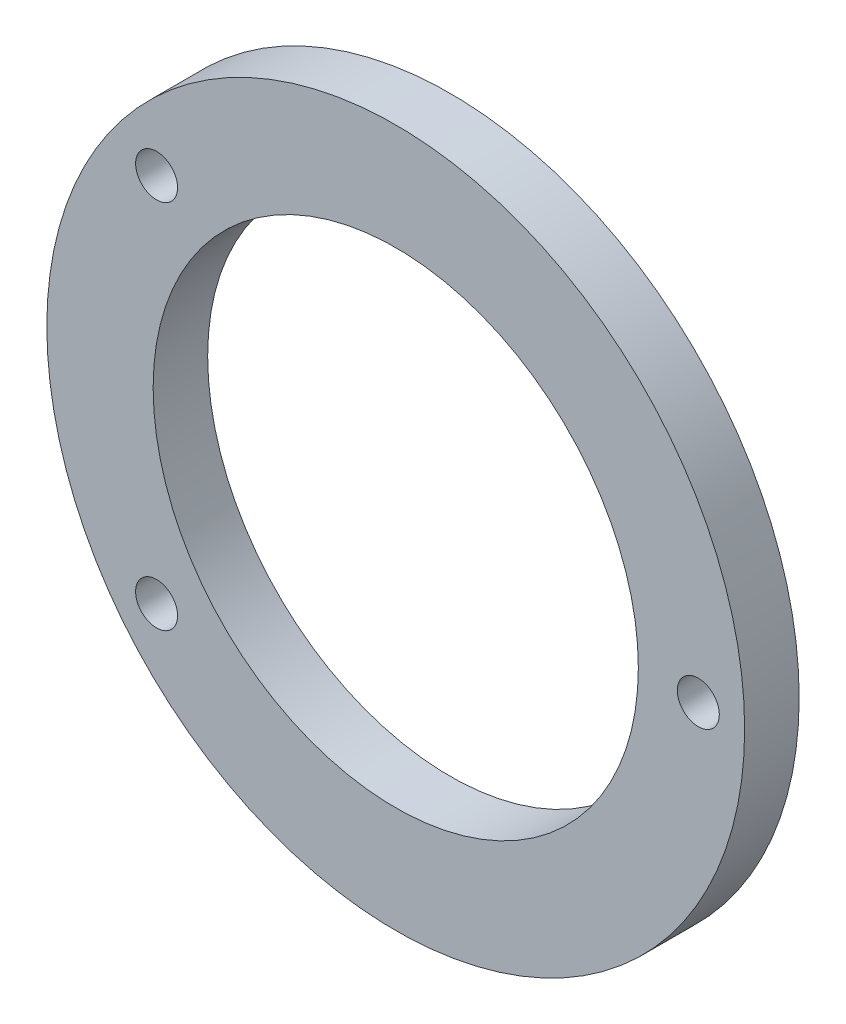
ISO-10303-21;
HEADER;
FILE_DESCRIPTION(('STEP AP214'),'2;1');
FILE_NAME('part.step','',(''),(''),'','','');
FILE_SCHEMA(('AUTOMOTIVE_DESIGN { 1 0 10303 214 1 1 1 1 }'));
ENDSEC;
DATA;
#1=APPLICATION_CONTEXT('core data for automotive mechanical design processes');
#2=APPLICATION_PROTOCOL_DEFINITION('international standard','automotive_design',2000,#1);
#3=PRODUCT_CONTEXT('',#1,'mechanical');
#4=PRODUCT('Part','Part','',(#3));
#5=PRODUCT_RELATED_PRODUCT_CATEGORY('part','',(#4));
#6=PRODUCT_DEFINITION_FORMATION('','',#4);
#7=PRODUCT_DEFINITION_CONTEXT('part definition',#1,'design');
#8=PRODUCT_DEFINITION('design','',#6,#7);
#9=PRODUCT_DEFINITION_SHAPE('','',#8);
#10=(LENGTH_UNIT() NAMED_UNIT(*) SI_UNIT(.MILLI.,.METRE.));
#11=(NAMED_UNIT(*) PLANE_ANGLE_UNIT() SI_UNIT($,.RADIAN.));
#12=(NAMED_UNIT(*) SI_UNIT($,.STERADIAN.) SOLID_ANGLE_UNIT());
#13=UNCERTAINTY_MEASURE_WITH_UNIT(LENGTH_MEASURE(1.E-05),#10,'distance_accuracy_value','');
#14=(GEOMETRIC_REPRESENTATION_CONTEXT(3) GLOBAL_UNCERTAINTY_ASSIGNED_CONTEXT((#13)) GLOBAL_UNIT_ASSIGNED_CONTEXT((#10,
#11,#12)) REPRESENTATION_CONTEXT('',''));
#15=CARTESIAN_POINT('',(0.,0.,0.));
#16=DIRECTION('',(0.,0.,1.));
#17=DIRECTION('',(1.,0.,0.));
#18=AXIS2_PLACEMENT_3D('',#15,#16,#17);
#19=CARTESIAN_POINT('',(0.,-2.22044604925031E-13,5.));
#20=DIRECTION('',(0.,0.,1.));
#21=DIRECTION('',(1.,0.,0.));
#22=AXIS2_PLACEMENT_3D('',#19,#20,#21);
#23=PLANE('',#22);
#24=CARTESIAN_POINT('',(-21.9331370305298,16.9999999999999,5.));
#25=DIRECTION('',(0.,0.,1.));
#26=DIRECTION('',(1.,0.,0.));
#27=AXIS2_PLACEMENT_3D('',#24,#25,#26);
#28=CIRCLE('',#27,1.92500000000001);
#29=CARTESIAN_POINT('',(-20.0081370305298,16.9999999999999,5.));
#30=VERTEX_POINT('',#29);
#31=EDGE_CURVE('E52',#30,#30,#28,.T.);
#32=ORIENTED_EDGE('',*,*,#31,.F.);
#33=EDGE_LOOP('',(#32));
#34=FACE_BOUND('',#33,.T.);
#35=CARTESIAN_POINT('',(0.,-2.22044604925031E-13,5.));
#36=DIRECTION('',(0.,0.,1.));
#37=DIRECTION('',(1.,0.,0.));
#38=AXIS2_PLACEMENT_3D('',#35,#36,#37);
#39=CIRCLE('',#38,22.25);
#40=CARTESIAN_POINT('',(22.2500000000001,-2.22044604925031E-13,5.));
#41=VERTEX_POINT('',#40);
#42=EDGE_CURVE('E41',#41,#41,#39,.T.);
#43=ORIENTED_EDGE('',*,*,#42,.F.);
#44=EDGE_LOOP('',(#43));
#45=FACE_BOUND('',#44,.T.);
#46=CARTESIAN_POINT('',(0.,-2.22044604925031E-13,5.));
#47=DIRECTION('',(0.,0.,1.));
#48=DIRECTION('',(1.,0.,0.));
#49=AXIS2_PLACEMENT_3D('',#46,#47,#48);
#50=CIRCLE('',#49,32.);
#51=CARTESIAN_POINT('',(32.0000000000001,-2.22044604925031E-13,5.));
#52=VERTEX_POINT('',#51);
#53=EDGE_CURVE('E10',#52,#52,#50,.T.);
#54=ORIENTED_EDGE('',*,*,#53,.T.);
#55=EDGE_LOOP('',(#54));
#56=FACE_BOUND('',#55,.T.);
#57=CARTESIAN_POINT('',(27.7500000000001,-2.22044604925031E-13,5.));
#58=DIRECTION('',(0.,0.,1.));
#59=DIRECTION('',(1.,0.,0.));
#60=AXIS2_PLACEMENT_3D('',#57,#58,#59);
#61=CIRCLE('',#60,1.92500000000007);
#62=CARTESIAN_POINT('',(29.6750000000001,-2.22044604925031E-13,5.));
#63=VERTEX_POINT('',#62);
#64=EDGE_CURVE('E46',#63,#63,#61,.T.);
#65=ORIENTED_EDGE('',*,*,#64,.F.);
#66=EDGE_LOOP('',(#65));
#67=FACE_BOUND('',#66,.T.);
#68=CARTESIAN_POINT('',(-21.9331370305298,-17.0000000000001,5.));
#69=DIRECTION('',(0.,0.,1.));
#70=DIRECTION('',(1.,0.,0.));
#71=AXIS2_PLACEMENT_3D('',#68,#69,#70);
#72=CIRCLE('',#71,1.92500000000001);
#73=CARTESIAN_POINT('',(-20.0081370305298,-17.0000000000001,5.));
#74=VERTEX_POINT('',#73);
#75=EDGE_CURVE('E58',#74,#74,#72,.T.);
#76=ORIENTED_EDGE('',*,*,#75,.F.);
#77=EDGE_LOOP('',(#76));
#78=FACE_BOUND('',#77,.T.);
#79=ADVANCED_FACE('F30',(#34,#45,#56,#67,#78),#23,.T.);
#80=CARTESIAN_POINT('',(0.,-2.22044604925031E-13,0.));
#81=DIRECTION('',(0.,0.,1.));
#82=DIRECTION('',(1.,0.,0.));
#83=AXIS2_PLACEMENT_3D('',#80,#81,#82);
#84=PLANE('',#83);
#85=CARTESIAN_POINT('',(0.,-2.22044604925031E-13,0.));
#86=DIRECTION('',(0.,0.,1.));
#87=DIRECTION('',(1.,0.,0.));
#88=AXIS2_PLACEMENT_3D('',#85,#86,#87);
#89=CIRCLE('',#88,32.);
#90=CARTESIAN_POINT('',(32.0000000000001,-2.22044604925031E-13,0.));
#91=VERTEX_POINT('',#90);
#92=EDGE_CURVE('E34',#91,#91,#89,.T.);
#93=ORIENTED_EDGE('',*,*,#92,.F.);
#94=EDGE_LOOP('',(#93));
#95=FACE_BOUND('',#94,.T.);
#96=CARTESIAN_POINT('',(0.,-2.22044604925031E-13,0.));
#97=DIRECTION('',(0.,0.,1.));
#98=DIRECTION('',(1.,0.,0.));
#99=AXIS2_PLACEMENT_3D('',#96,#97,#98);
#100=CIRCLE('',#99,22.25);
#101=CARTESIAN_POINT('',(22.2500000000001,-2.22044604925031E-13,0.));
#102=VERTEX_POINT('',#101);
#103=EDGE_CURVE('E43',#102,#102,#100,.T.);
#104=ORIENTED_EDGE('',*,*,#103,.T.);
#105=EDGE_LOOP('',(#104));
#106=FACE_BOUND('',#105,.T.);
#107=CARTESIAN_POINT('',(27.7500000000001,-2.22044604925031E-13,0.));
#108=DIRECTION('',(0.,0.,1.));
#109=DIRECTION('',(1.,0.,0.));
#110=AXIS2_PLACEMENT_3D('',#107,#108,#109);
#111=CIRCLE('',#110,1.92500000000007);
#112=CARTESIAN_POINT('',(29.6750000000001,-2.22044604925031E-13,0.));
#113=VERTEX_POINT('',#112);
#114=EDGE_CURVE('E49',#113,#113,#111,.T.);
#115=ORIENTED_EDGE('',*,*,#114,.T.);
#116=EDGE_LOOP('',(#115));
#117=FACE_BOUND('',#116,.T.);
#118=CARTESIAN_POINT('',(-21.9331370305298,16.9999999999999,0.));
#119=DIRECTION('',(0.,0.,1.));
#120=DIRECTION('',(1.,0.,0.));
#121=AXIS2_PLACEMENT_3D('',#118,#119,#120);
#122=CIRCLE('',#121,1.92500000000001);
#123=CARTESIAN_POINT('',(-20.0081370305298,16.9999999999999,0.));
#124=VERTEX_POINT('',#123);
#125=EDGE_CURVE('E55',#124,#124,#122,.T.);
#126=ORIENTED_EDGE('',*,*,#125,.T.);
#127=EDGE_LOOP('',(#126));
#128=FACE_BOUND('',#127,.T.);
#129=CARTESIAN_POINT('',(-21.9331370305298,-17.0000000000001,0.));
#130=DIRECTION('',(0.,0.,1.));
#131=DIRECTION('',(1.,0.,0.));
#132=AXIS2_PLACEMENT_3D('',#129,#130,#131);
#133=CIRCLE('',#132,1.92500000000001);
#134=CARTESIAN_POINT('',(-20.0081370305298,-17.0000000000001,0.));
#135=VERTEX_POINT('',#134);
#136=EDGE_CURVE('E61',#135,#135,#133,.T.);
#137=ORIENTED_EDGE('',*,*,#136,.T.);
#138=EDGE_LOOP('',(#137));
#139=FACE_BOUND('',#138,.T.);
#140=ADVANCED_FACE('F71',(#95,#106,#117,#128,#139),#84,.F.);
#141=CARTESIAN_POINT('',(0.,-2.22044604925031E-13,5.));
#142=DIRECTION('',(0.,0.,-1.));
#143=DIRECTION('',(-1.,0.,0.));
#144=AXIS2_PLACEMENT_3D('',#141,#142,#143);
#145=CYLINDRICAL_SURFACE('',#144,32.);
#146=ORIENTED_EDGE('',*,*,#53,.F.);
#147=EDGE_LOOP('',(#146));
#148=FACE_BOUND('',#147,.T.);
#149=ORIENTED_EDGE('',*,*,#92,.T.);
#150=EDGE_LOOP('',(#149));
#151=FACE_BOUND('',#150,.T.);
#152=ADVANCED_FACE('F32',(#148,#151),#145,.T.);
#153=CARTESIAN_POINT('',(0.,-2.22044604925031E-13,5.));
#154=DIRECTION('',(0.,0.,-1.));
#155=DIRECTION('',(-1.,0.,0.));
#156=AXIS2_PLACEMENT_3D('',#153,#154,#155);
#157=CYLINDRICAL_SURFACE('',#156,22.25);
#158=ORIENTED_EDGE('',*,*,#42,.T.);
#159=EDGE_LOOP('',(#158));
#160=FACE_BOUND('',#159,.T.);
#161=ORIENTED_EDGE('',*,*,#103,.F.);
#162=EDGE_LOOP('',(#161));
#163=FACE_BOUND('',#162,.T.);
#164=ADVANCED_FACE('F81',(#160,#163),#157,.F.);
#165=CARTESIAN_POINT('',(27.7500000000001,-2.22044604925031E-13,5.));
#166=DIRECTION('',(0.,0.,-1.));
#167=DIRECTION('',(-1.,0.,0.));
#168=AXIS2_PLACEMENT_3D('',#165,#166,#167);
#169=CYLINDRICAL_SURFACE('',#168,1.92500000000007);
#170=ORIENTED_EDGE('',*,*,#64,.T.);
#171=EDGE_LOOP('',(#170));
#172=FACE_BOUND('',#171,.T.);
#173=ORIENTED_EDGE('',*,*,#114,.F.);
#174=EDGE_LOOP('',(#173));
#175=FACE_BOUND('',#174,.T.);
#176=ADVANCED_FACE('F84',(#172,#175),#169,.F.);
#177=CARTESIAN_POINT('',(-21.9331370305298,16.9999999999999,5.));
#178=DIRECTION('',(0.,0.,-1.));
#179=DIRECTION('',(-1.,0.,0.));
#180=AXIS2_PLACEMENT_3D('',#177,#178,#179);
#181=CYLINDRICAL_SURFACE('',#180,1.92500000000001);
#182=ORIENTED_EDGE('',*,*,#31,.T.);
#183=EDGE_LOOP('',(#182));
#184=FACE_BOUND('',#183,.T.);
#185=ORIENTED_EDGE('',*,*,#125,.F.);
#186=EDGE_LOOP('',(#185));
#187=FACE_BOUND('',#186,.T.);
#188=ADVANCED_FACE('F88',(#184,#187),#181,.F.);
#189=CARTESIAN_POINT('',(-21.9331370305298,-17.0000000000001,5.));
#190=DIRECTION('',(0.,0.,-1.));
#191=DIRECTION('',(-1.,0.,0.));
#192=AXIS2_PLACEMENT_3D('',#189,#190,#191);
#193=CYLINDRICAL_SURFACE('',#192,1.92500000000001);
#194=ORIENTED_EDGE('',*,*,#75,.T.);
#195=EDGE_LOOP('',(#194));
#196=FACE_BOUND('',#195,.T.);
#197=ORIENTED_EDGE('',*,*,#136,.F.);
#198=EDGE_LOOP('',(#197));
#199=FACE_BOUND('',#198,.T.);
#200=ADVANCED_FACE('F67',(#196,#199),#193,.F.);
#201=CLOSED_SHELL('',(#79,#140,#152,#164,#176,#188,#200));
#202=MANIFOLD_SOLID_BREP('B2',#201);
#203=ADVANCED_BREP_SHAPE_REPRESENTATION('',(#18,#202),#14);
#204=SHAPE_DEFINITION_REPRESENTATION(#9,#203);
ENDSEC;
END-ISO-10303-21;
